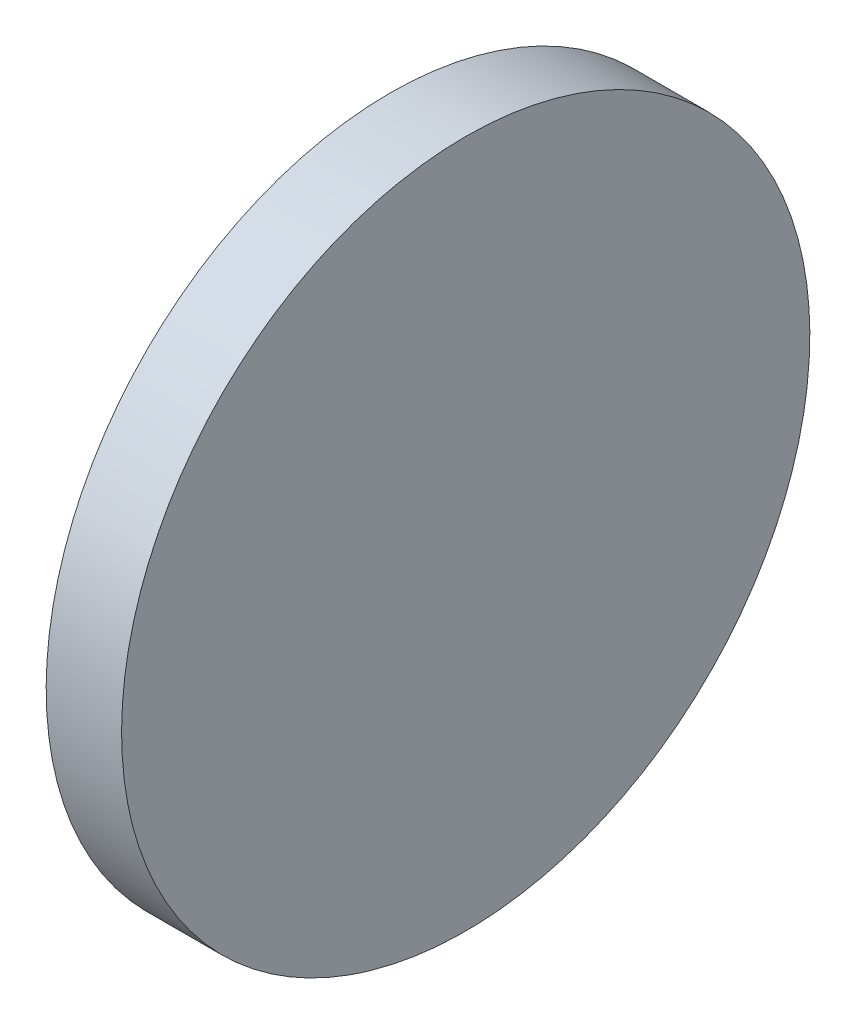
ISO-10303-21;
HEADER;
FILE_DESCRIPTION(('STEP AP214'),'2;1');
FILE_NAME('part.step','',(''),(''),'','','');
FILE_SCHEMA(('AUTOMOTIVE_DESIGN { 1 0 10303 214 1 1 1 1 }'));
ENDSEC;
DATA;
#1=APPLICATION_CONTEXT('core data for automotive mechanical design processes');
#2=APPLICATION_PROTOCOL_DEFINITION('international standard','automotive_design',2000,#1);
#3=PRODUCT_CONTEXT('',#1,'mechanical');
#4=PRODUCT('Part','Part','',(#3));
#5=PRODUCT_RELATED_PRODUCT_CATEGORY('part','',(#4));
#6=PRODUCT_DEFINITION_FORMATION('','',#4);
#7=PRODUCT_DEFINITION_CONTEXT('part definition',#1,'design');
#8=PRODUCT_DEFINITION('design','',#6,#7);
#9=PRODUCT_DEFINITION_SHAPE('','',#8);
#10=(LENGTH_UNIT() NAMED_UNIT(*) SI_UNIT(.MILLI.,.METRE.));
#11=(NAMED_UNIT(*) PLANE_ANGLE_UNIT() SI_UNIT($,.RADIAN.));
#12=(NAMED_UNIT(*) SI_UNIT($,.STERADIAN.) SOLID_ANGLE_UNIT());
#13=UNCERTAINTY_MEASURE_WITH_UNIT(LENGTH_MEASURE(1.E-05),#10,'distance_accuracy_value','');
#14=(GEOMETRIC_REPRESENTATION_CONTEXT(3) GLOBAL_UNCERTAINTY_ASSIGNED_CONTEXT((#13)) GLOBAL_UNIT_ASSIGNED_CONTEXT((#10,
#11,#12)) REPRESENTATION_CONTEXT('',''));
#15=CARTESIAN_POINT('',(0.,0.,0.));
#16=DIRECTION('',(0.,0.,1.));
#17=DIRECTION('',(1.,0.,0.));
#18=AXIS2_PLACEMENT_3D('',#15,#16,#17);
#19=CARTESIAN_POINT('',(445.899457677506,890.681917975775,787.719011934803));
#20=CARTESIAN_POINT('',(445.899457677506,890.681917975775,790.001844551573));
#21=CARTESIAN_POINT('',(445.899457677506,890.232239199665,794.567509785113));
#22=CARTESIAN_POINT('',(445.899457677506,888.234606061943,801.152823703718));
#23=CARTESIAN_POINT('',(445.899457677506,884.990625871862,807.221883769811));
#24=CARTESIAN_POINT('',(445.899457677506,880.624962968881,812.541459408622));
#25=CARTESIAN_POINT('',(445.899457677506,875.30538733007,816.907122311603));
#26=CARTESIAN_POINT('',(445.899457677506,869.236327263976,820.151102501684));
#27=CARTESIAN_POINT('',(445.899457677506,862.651013345372,822.148735639407));
#28=CARTESIAN_POINT('',(445.899457677506,855.802515495061,822.823253803572));
#29=CARTESIAN_POINT('',(445.899457677506,848.954017644751,822.148735639407));
#30=CARTESIAN_POINT('',(445.899457677506,842.368703726147,820.151102501684));
#31=CARTESIAN_POINT('',(445.899457677506,836.299643660053,816.907122311603));
#32=CARTESIAN_POINT('',(445.899457677506,830.980068021242,812.541459408622));
#33=CARTESIAN_POINT('',(445.899457677506,826.614405118261,807.221883769811));
#34=CARTESIAN_POINT('',(445.899457677506,823.37042492818,801.152823703718));
#35=CARTESIAN_POINT('',(445.899457677506,821.372791790458,794.567509785113));
#36=CARTESIAN_POINT('',(445.899457677506,820.698273626292,787.719011934803));
#37=CARTESIAN_POINT('',(445.899457677506,821.372791790458,780.870514084493));
#38=CARTESIAN_POINT('',(445.899457677506,823.37042492818,774.285200165888));
#39=CARTESIAN_POINT('',(445.899457677506,826.614405118261,768.216140099795));
#40=CARTESIAN_POINT('',(445.899457677506,830.980068021242,762.896564460984));
#41=CARTESIAN_POINT('',(445.899457677506,836.299643660053,758.530901558003));
#42=CARTESIAN_POINT('',(445.899457677506,842.368703726147,755.286921367921));
#43=CARTESIAN_POINT('',(445.899457677506,848.954017644751,753.2892882302));
#44=CARTESIAN_POINT('',(445.899457677506,855.802515495061,752.614770066034));
#45=CARTESIAN_POINT('',(445.899457677506,862.651013345372,753.2892882302));
#46=CARTESIAN_POINT('',(445.899457677506,869.236327263976,755.286921367922));
#47=CARTESIAN_POINT('',(445.899457677506,875.30538733007,758.530901558003));
#48=CARTESIAN_POINT('',(445.899457677506,880.62496296888,762.896564460983));
#49=CARTESIAN_POINT('',(445.899457677506,884.990625871862,768.216140099795));
#50=CARTESIAN_POINT('',(445.899457677506,888.234606061943,774.285200165888));
#51=CARTESIAN_POINT('',(445.899457677506,890.232239199665,780.870514084493));
#52=CARTESIAN_POINT('',(445.899457677506,890.681917975775,785.436179318033));
#53=CARTESIAN_POINT('',(445.899457677506,890.681917975775,787.719011934803));
#54=B_SPLINE_CURVE_WITH_KNOTS('',3,(#19,#20,#21,#22,#23,#24,#25,#26,#27,#28,#29,#30,#31,#32,#33,
#34,#35,#36,#37,#38,#39,#40,#41,#42,#43,#44,#45,#46,#47,#48,#49,#50,#51,#52,#53),.UNSPECIFIED.,
.T.,.F.,(4,1,1,1,1,1,1,1,1,1,1,1,1,1,1,1,1,1,1,1,1,1,1,1,1,1,1,1,1,1,1,1,4),(0.,0.03125,
0.0625000000000001,0.0937499999999999,0.125,0.15625,0.1875,0.21875,0.25,0.28125,0.3125,0.34375,
0.375,0.40625,0.4375,0.46875,0.5,0.53125,0.5625,0.59375,0.625,0.65625,0.6875,0.71875,0.75,
0.78125,0.8125,0.84375,0.875,0.90625,0.9375,0.96875,1.),.UNSPECIFIED.);
#55=DIRECTION('',(1.,0.,0.));
#56=VECTOR('',#55,1.);
#57=SURFACE_OF_LINEAR_EXTRUSION('',#54,#56);
#58=CARTESIAN_POINT('',(445.899457677506,890.681917975775,787.719011934803));
#59=CARTESIAN_POINT('',(445.899457677506,890.68191795348,788.175580286464));
#60=CARTESIAN_POINT('',(445.899457677506,890.672924330318,788.632146642336));
#61=CARTESIAN_POINT('',(445.899457677506,890.63701917391,789.544577537184));
#62=CARTESIAN_POINT('',(445.899457677506,890.610107523089,790.000442071537));
#63=CARTESIAN_POINT('',(445.899457677506,890.538435483694,790.910767026361));
#64=CARTESIAN_POINT('',(445.899457677506,890.493675034787,791.36522744208));
#65=CARTESIAN_POINT('',(445.899457677506,890.386374357463,792.272043072159));
#66=CARTESIAN_POINT('',(445.899457677506,890.323834189149,792.72439829363));
#67=CARTESIAN_POINT('',(445.899457677506,890.181042891971,793.626302453057));
#68=CARTESIAN_POINT('',(445.899457677506,890.100791879326,794.07585140941));
#69=CARTESIAN_POINT('',(445.899457677506,889.922648195485,794.971440183581));
#70=CARTESIAN_POINT('',(445.899457677506,889.82475552429,795.417480001401));
#71=CARTESIAN_POINT('',(445.899457677506,889.611533706096,796.305374648089));
#72=CARTESIAN_POINT('',(445.899457677506,889.496204444687,796.747229449477));
#73=CARTESIAN_POINT('',(445.899457677506,889.24831401028,797.626080082421));
#74=CARTESIAN_POINT('',(445.899457677506,889.115752779035,798.063075897548));
#75=CARTESIAN_POINT('',(445.899457677506,888.833602891365,798.931534039254));
#76=CARTESIAN_POINT('',(445.899457677506,888.684014292501,799.362996384533));
#77=CARTESIAN_POINT('',(445.899457677506,888.368013919712,800.219713496664));
#78=CARTESIAN_POINT('',(445.899457677506,888.201602256185,800.64496830423));
#79=CARTESIAN_POINT('',(445.899457677506,887.852160850248,801.488594485701));
#80=CARTESIAN_POINT('',(445.899457677506,887.669131107839,801.906965859606));
#81=CARTESIAN_POINT('',(445.899457677506,887.286786634738,802.73620234562));
#82=CARTESIAN_POINT('',(445.899457677506,887.087471797194,803.147067408455));
#83=CARTESIAN_POINT('',(445.899457677506,886.672889254941,803.960670148471));
#84=CARTESIAN_POINT('',(445.899457677506,886.457621496309,804.363407798173));
#85=CARTESIAN_POINT('',(445.899457677506,886.011465261105,805.160134047703));
#86=CARTESIAN_POINT('',(445.899457677506,885.780576837339,805.5541226771));
#87=CARTESIAN_POINT('',(445.899457677506,885.30351110582,806.332729595679));
#88=CARTESIAN_POINT('',(445.899457677506,885.0573338984,806.71734794633));
#89=CARTESIAN_POINT('',(445.899457677506,884.55002360769,807.476591450865));
#90=CARTESIAN_POINT('',(445.899457677506,884.288890524402,807.85121660475));
#91=CARTESIAN_POINT('',(445.899457677506,883.752116680056,808.589927837828));
#92=CARTESIAN_POINT('',(445.899457677506,883.476475823814,808.95401384785));
#93=CARTESIAN_POINT('',(445.899457677506,882.911133348318,809.671102397682));
#94=CARTESIAN_POINT('',(445.899457677506,882.621431681537,810.024104900022));
#95=CARTESIAN_POINT('',(445.899457677506,882.02841463271,810.718481514477));
#96=CARTESIAN_POINT('',(445.899457677506,881.725099296685,811.059855665894));
#97=CARTESIAN_POINT('',(445.899457677506,881.105301574956,811.730430963671));
#98=CARTESIAN_POINT('',(445.899457677506,880.788819275666,812.059632189894));
#99=CARTESIAN_POINT('',(445.899457677506,880.143135750153,812.705315715407));
#100=CARTESIAN_POINT('',(445.899457677506,879.81393452393,813.021798014698));
#101=CARTESIAN_POINT('',(445.899457677506,879.143359226152,813.641595736426));
#102=CARTESIAN_POINT('',(445.899457677506,878.801985074735,813.944911072451));
#103=CARTESIAN_POINT('',(445.899457677506,878.107608460281,814.537928121278));
#104=CARTESIAN_POINT('',(445.899457677506,877.75460595794,814.827629788059));
#105=CARTESIAN_POINT('',(445.899457677506,877.037517408108,815.392972263555));
#106=CARTESIAN_POINT('',(445.899457677506,876.673431398086,815.668613119798));
#107=CARTESIAN_POINT('',(445.899457677506,875.934720165008,816.205386964143));
#108=CARTESIAN_POINT('',(445.899457677506,875.560095011124,816.466520047432));
#109=CARTESIAN_POINT('',(445.899457677506,874.800851506589,816.973830338141));
#110=CARTESIAN_POINT('',(445.899457677506,874.416233155938,817.220007545562));
#111=CARTESIAN_POINT('',(445.899457677506,873.637626237359,817.697073277081));
#112=CARTESIAN_POINT('',(445.899457677506,873.243637607961,817.927961700847));
#113=CARTESIAN_POINT('',(445.899457677506,872.446911358431,818.37411793605));
#114=CARTESIAN_POINT('',(445.899457677506,872.044173708729,818.589385694683));
#115=CARTESIAN_POINT('',(445.899457677506,871.230570968714,819.003968236935));
#116=CARTESIAN_POINT('',(445.899457677506,870.819705905879,819.203283074479));
#117=CARTESIAN_POINT('',(445.899457677506,869.990469419864,819.58562754758));
#118=CARTESIAN_POINT('',(445.899457677506,869.572098045958,819.76865728999));
#119=CARTESIAN_POINT('',(445.899457677506,868.728471864491,820.118098695926));
#120=CARTESIAN_POINT('',(445.899457677506,868.303217056931,820.284510359453));
#121=CARTESIAN_POINT('',(445.899457677506,867.446499944784,820.600510732243));
#122=CARTESIAN_POINT('',(445.899457677506,867.015037599482,820.750099331108));
#123=CARTESIAN_POINT('',(445.899457677506,866.146579457837,821.032249218776));
#124=CARTESIAN_POINT('',(445.899457677506,865.709583642794,821.16481045002));
#125=CARTESIAN_POINT('',(445.899457677506,864.830733009621,821.412700884431));
#126=CARTESIAN_POINT('',(445.899457677506,864.388878207921,821.528030145846));
#127=CARTESIAN_POINT('',(445.899457677506,863.500983562086,821.741251964023));
#128=CARTESIAN_POINT('',(445.899457677506,863.054943745432,821.839144635196));
#129=CARTESIAN_POINT('',(445.899457677506,862.159354968077,822.017288319098));
#130=CARTESIAN_POINT('',(445.899457677506,861.709806007376,822.097539331828));
#131=CARTESIAN_POINT('',(445.899457677506,860.807901859828,822.240330628775));
#132=CARTESIAN_POINT('',(445.899457677506,860.355546654585,822.302870796776));
#133=CARTESIAN_POINT('',(445.899457677506,859.448730980171,822.410171474957));
#134=CARTESIAN_POINT('',(445.899457677506,858.994270503889,822.454931925036));
#135=CARTESIAN_POINT('',(445.899457677506,858.083945714526,822.52660396123));
#136=CARTESIAN_POINT('',(445.899457677506,857.628081406196,822.553515607678));
#137=CARTESIAN_POINT('',(445.899457677506,856.715649893843,822.589420776034));
#138=CARTESIAN_POINT('',(445.899457677506,856.259082694452,822.598414415517));
#139=CARTESIAN_POINT('',(445.899457677506,855.345948295671,822.598414415517));
#140=CARTESIAN_POINT('',(445.899457677506,854.88938109628,822.589420776034));
#141=CARTESIAN_POINT('',(445.899457677506,853.976949583927,822.553515607677));
#142=CARTESIAN_POINT('',(445.899457677506,853.521085275597,822.52660396123));
#143=CARTESIAN_POINT('',(445.899457677506,852.610760486234,822.454931925036));
#144=CARTESIAN_POINT('',(445.899457677506,852.156300009952,822.410171474957));
#145=CARTESIAN_POINT('',(445.899457677506,851.249484335538,822.302870796776));
#146=CARTESIAN_POINT('',(445.899457677506,850.797129130295,822.240330628775));
#147=CARTESIAN_POINT('',(445.899457677506,849.895224982747,822.097539331828));
#148=CARTESIAN_POINT('',(445.899457677506,849.445676022046,822.017288319098));
#149=CARTESIAN_POINT('',(445.899457677506,848.550087244692,821.839144635196));
#150=CARTESIAN_POINT('',(445.899457677506,848.104047428037,821.741251964023));
#151=CARTESIAN_POINT('',(445.899457677506,847.216152782202,821.528030145846));
#152=CARTESIAN_POINT('',(445.899457677506,846.774297980502,821.41270088443));
#153=CARTESIAN_POINT('',(445.899457677506,845.895447347329,821.16481045002));
#154=CARTESIAN_POINT('',(445.899457677506,845.458451532286,821.032249218776));
#155=CARTESIAN_POINT('',(445.899457677506,844.589993390641,820.750099331108));
#156=CARTESIAN_POINT('',(445.899457677506,844.158531045339,820.600510732243));
#157=CARTESIAN_POINT('',(445.899457677506,843.301813933192,820.284510359453));
#158=CARTESIAN_POINT('',(445.899457677506,842.876559125632,820.118098695926));
#159=CARTESIAN_POINT('',(445.899457677506,842.032932944165,819.76865728999));
#160=CARTESIAN_POINT('',(445.899457677506,841.614561570259,819.58562754758));
#161=CARTESIAN_POINT('',(445.899457677506,840.785325084244,819.203283074479));
#162=CARTESIAN_POINT('',(445.899457677506,840.374460021409,819.003968236935));
#163=CARTESIAN_POINT('',(445.899457677506,839.560857281394,818.589385694683));
#164=CARTESIAN_POINT('',(445.899457677506,839.158119631692,818.37411793605));
#165=CARTESIAN_POINT('',(445.899457677506,838.361393382162,817.927961700847));
#166=CARTESIAN_POINT('',(445.899457677506,837.967404752764,817.697073277081));
#167=CARTESIAN_POINT('',(445.899457677506,837.188797834185,817.220007545562));
#168=CARTESIAN_POINT('',(445.899457677506,836.804179483534,816.973830338141));
#169=CARTESIAN_POINT('',(445.899457677506,836.044935978999,816.466520047432));
#170=CARTESIAN_POINT('',(445.899457677506,835.670310825115,816.205386964143));
#171=CARTESIAN_POINT('',(445.899457677506,834.931599592037,815.668613119798));
#172=CARTESIAN_POINT('',(445.899457677506,834.567513582015,815.392972263555));
#173=CARTESIAN_POINT('',(445.899457677506,833.850425032183,814.827629788059));
#174=CARTESIAN_POINT('',(445.899457677506,833.497422529842,814.537928121278));
#175=CARTESIAN_POINT('',(445.899457677506,832.803045915388,813.944911072451));
#176=CARTESIAN_POINT('',(445.899457677506,832.46167176397,813.641595736426));
#177=CARTESIAN_POINT('',(445.899457677506,831.791096466193,813.021798014698));
#178=CARTESIAN_POINT('',(445.899457677506,831.461895239971,812.705315715407));
#179=CARTESIAN_POINT('',(445.899457677506,830.816211714457,812.059632189894));
#180=CARTESIAN_POINT('',(445.899457677506,830.499729415166,811.730430963671));
#181=CARTESIAN_POINT('',(445.899457677506,829.879931693438,811.059855665894));
#182=CARTESIAN_POINT('',(445.899457677506,829.576616357413,810.718481514477));
#183=CARTESIAN_POINT('',(445.899457677506,828.983599308586,810.024104900022));
#184=CARTESIAN_POINT('',(445.899457677506,828.693897641806,809.671102397682));
#185=CARTESIAN_POINT('',(445.899457677506,828.128555166309,808.95401384785));
#186=CARTESIAN_POINT('',(445.899457677506,827.852914310067,808.589927837828));
#187=CARTESIAN_POINT('',(445.899457677506,827.316140465721,807.85121660475));
#188=CARTESIAN_POINT('',(445.899457677506,827.055007382433,807.476591450865));
#189=CARTESIAN_POINT('',(445.899457677506,826.547697091723,806.71734794633));
#190=CARTESIAN_POINT('',(445.899457677506,826.301519884303,806.332729595679));
#191=CARTESIAN_POINT('',(445.899457677506,825.824454152783,805.5541226771));
#192=CARTESIAN_POINT('',(445.899457677506,825.593565729018,805.160134047703));
#193=CARTESIAN_POINT('',(445.899457677506,825.147409493814,804.363407798173));
#194=CARTESIAN_POINT('',(445.899457677506,824.932141735182,803.960670148471));
#195=CARTESIAN_POINT('',(445.899457677506,824.517559192929,803.147067408456));
#196=CARTESIAN_POINT('',(445.899457677506,824.318244355385,802.73620234562));
#197=CARTESIAN_POINT('',(445.899457677506,823.935899882284,801.906965859606));
#198=CARTESIAN_POINT('',(445.899457677506,823.752870139875,801.488594485699));
#199=CARTESIAN_POINT('',(445.899457677506,823.403428733938,800.644968304233));
#200=CARTESIAN_POINT('',(445.899457677506,823.237017070411,800.219713496673));
#201=CARTESIAN_POINT('',(445.899457677506,822.921016697622,799.362996384526));
#202=CARTESIAN_POINT('',(445.899457677506,822.771428098757,798.931534039224));
#203=CARTESIAN_POINT('',(445.899457677506,822.489278211089,798.063075897579));
#204=CARTESIAN_POINT('',(445.899457677506,822.356716979845,797.626080082535));
#205=CARTESIAN_POINT('',(445.899457677506,822.108826545434,796.747229449362));
#206=CARTESIAN_POINT('',(445.899457677506,821.993497284019,796.305374647663));
#207=CARTESIAN_POINT('',(445.899457677506,821.780275465842,795.417480001828));
#208=CARTESIAN_POINT('',(445.899457677506,821.682382794668,794.971440185173));
#209=CARTESIAN_POINT('',(445.899457677506,821.504239110766,794.075851407818));
#210=CARTESIAN_POINT('',(445.899457677506,821.423988098037,793.626302447118));
#211=CARTESIAN_POINT('',(445.899457677506,821.281196801089,792.72439829957));
#212=CARTESIAN_POINT('',(445.899457677506,821.218656633089,792.272043094327));
#213=CARTESIAN_POINT('',(445.899457677506,821.111355954907,791.365227419913));
#214=CARTESIAN_POINT('',(445.899457677506,821.066595504828,790.910766943631));
#215=CARTESIAN_POINT('',(445.899457677506,820.994923468635,790.000442154267));
#216=CARTESIAN_POINT('',(445.899457677506,820.968011822187,789.544577845938));
#217=CARTESIAN_POINT('',(445.899457677506,820.93210665383,788.632146333585));
#218=CARTESIAN_POINT('',(445.899457677506,820.923113014347,788.175579134194));
#219=CARTESIAN_POINT('',(445.899457677506,820.923113014347,787.262444735412));
#220=CARTESIAN_POINT('',(445.899457677506,820.93210665383,786.805877536021));
#221=CARTESIAN_POINT('',(445.899457677506,820.968011822187,785.893446023669));
#222=CARTESIAN_POINT('',(445.899457677506,820.994923468635,785.437581715339));
#223=CARTESIAN_POINT('',(445.899457677506,821.066595504828,784.527256925976));
#224=CARTESIAN_POINT('',(445.899457677506,821.111355954907,784.072796449693));
#225=CARTESIAN_POINT('',(445.899457677506,821.218656633089,783.165980775279));
#226=CARTESIAN_POINT('',(445.899457677506,821.281196801089,782.713625570037));
#227=CARTESIAN_POINT('',(445.899457677506,821.423988098037,781.811721422488));
#228=CARTESIAN_POINT('',(445.899457677506,821.504239110766,781.362172461788));
#229=CARTESIAN_POINT('',(445.899457677506,821.682382794669,780.466583684433));
#230=CARTESIAN_POINT('',(445.899457677506,821.780275465842,780.020543867778));
#231=CARTESIAN_POINT('',(445.899457677506,821.993497284019,779.132649221943));
#232=CARTESIAN_POINT('',(445.899457677506,822.108826545434,778.690794420244));
#233=CARTESIAN_POINT('',(445.899457677506,822.356716979845,777.811943787071));
#234=CARTESIAN_POINT('',(445.899457677506,822.489278211089,777.374947972027));
#235=CARTESIAN_POINT('',(445.899457677506,822.771428098757,776.506489830382));
#236=CARTESIAN_POINT('',(445.899457677506,822.921016697622,776.075027485081));
#237=CARTESIAN_POINT('',(445.899457677506,823.237017070411,775.218310372933));
#238=CARTESIAN_POINT('',(445.899457677506,823.403428733938,774.793055565373));
#239=CARTESIAN_POINT('',(445.899457677506,823.752870139875,773.949429383907));
#240=CARTESIAN_POINT('',(445.899457677506,823.935899882284,773.53105801));
#241=CARTESIAN_POINT('',(445.899457677506,824.318244355385,772.701821523986));
#242=CARTESIAN_POINT('',(445.899457677506,824.517559192929,772.290956461151));
#243=CARTESIAN_POINT('',(445.899457677506,824.932141735182,771.477353721136));
#244=CARTESIAN_POINT('',(445.899457677506,825.147409493814,771.074616071433));
#245=CARTESIAN_POINT('',(445.899457677506,825.593565729017,770.277889821903));
#246=CARTESIAN_POINT('',(445.899457677506,825.824454152783,769.883901192506));
#247=CARTESIAN_POINT('',(445.899457677506,826.301519884303,769.105294273927));
#248=CARTESIAN_POINT('',(445.899457677506,826.547697091723,768.720675923276));
#249=CARTESIAN_POINT('',(445.899457677506,827.055007382433,767.961432418741));
#250=CARTESIAN_POINT('',(445.899457677506,827.316140465721,767.586807264856));
#251=CARTESIAN_POINT('',(445.899457677506,827.852914310067,766.848096031778));
#252=CARTESIAN_POINT('',(445.899457677506,828.128555166309,766.484010021756));
#253=CARTESIAN_POINT('',(445.899457677506,828.693897641806,765.766921471924));
#254=CARTESIAN_POINT('',(445.899457677506,828.983599308586,765.413918969584));
#255=CARTESIAN_POINT('',(445.899457677506,829.576616357413,764.719542355129));
#256=CARTESIAN_POINT('',(445.899457677506,829.879931693438,764.378168203712));
#257=CARTESIAN_POINT('',(445.899457677506,830.499729415166,763.707592905935));
#258=CARTESIAN_POINT('',(445.899457677506,830.816211714457,763.378391679712));
#259=CARTESIAN_POINT('',(445.899457677506,831.461895239971,762.732708154199));
#260=CARTESIAN_POINT('',(445.899457677506,831.791096466193,762.416225854908));
#261=CARTESIAN_POINT('',(445.899457677506,832.46167176397,761.796428133179));
#262=CARTESIAN_POINT('',(445.899457677506,832.803045915387,761.493112797155));
#263=CARTESIAN_POINT('',(445.899457677506,833.497422529842,760.900095748328));
#264=CARTESIAN_POINT('',(445.899457677506,833.850425032183,760.610394081547));
#265=CARTESIAN_POINT('',(445.899457677506,834.567513582015,760.045051606051));
#266=CARTESIAN_POINT('',(445.899457677506,834.931599592037,759.769410749808));
#267=CARTESIAN_POINT('',(445.899457677506,835.670310825115,759.232636905463));
#268=CARTESIAN_POINT('',(445.899457677506,836.044935978999,758.971503822174));
#269=CARTESIAN_POINT('',(445.899457677506,836.804179483534,758.464193531465));
#270=CARTESIAN_POINT('',(445.899457677506,837.188797834185,758.218016324044));
#271=CARTESIAN_POINT('',(445.899457677506,837.967404752764,757.740950592525));
#272=CARTESIAN_POINT('',(445.899457677506,838.361393382162,757.510062168759));
#273=CARTESIAN_POINT('',(445.899457677506,839.158119631692,757.063905933556));
#274=CARTESIAN_POINT('',(445.899457677506,839.560857281394,756.848638174923));
#275=CARTESIAN_POINT('',(445.899457677506,840.374460021409,756.43405563267));
#276=CARTESIAN_POINT('',(445.899457677506,840.785325084244,756.234740795127));
#277=CARTESIAN_POINT('',(445.899457677506,841.614561570259,755.852396322025));
#278=CARTESIAN_POINT('',(445.899457677506,842.032932944165,755.669366579616));
#279=CARTESIAN_POINT('',(445.899457677506,842.876559125632,755.31992517368));
#280=CARTESIAN_POINT('',(445.899457677506,843.301813933192,755.153513510153));
#281=CARTESIAN_POINT('',(445.899457677506,844.158531045339,754.837513137363));
#282=CARTESIAN_POINT('',(445.899457677506,844.589993390641,754.687924538498));
#283=CARTESIAN_POINT('',(445.899457677506,845.458451532286,754.40577465083));
#284=CARTESIAN_POINT('',(445.899457677506,845.895447347329,754.273213419587));
#285=CARTESIAN_POINT('',(445.899457677506,846.774297980502,754.025322985176));
#286=CARTESIAN_POINT('',(445.899457677506,847.216152782202,753.90999372376));
#287=CARTESIAN_POINT('',(445.899457677506,848.104047428037,753.696771905583));
#288=CARTESIAN_POINT('',(445.899457677506,848.550087244691,753.59887923441));
#289=CARTESIAN_POINT('',(445.899457677506,849.445676022046,753.420735550508));
#290=CARTESIAN_POINT('',(445.899457677506,849.895224982747,753.340484537779));
#291=CARTESIAN_POINT('',(445.899457677506,850.797129130295,753.197693240831));
#292=CARTESIAN_POINT('',(445.899457677506,851.249484335538,753.13515307283));
#293=CARTESIAN_POINT('',(445.899457677506,852.156300009952,753.027852394649));
#294=CARTESIAN_POINT('',(445.899457677506,852.610760486234,752.98309194457));
#295=CARTESIAN_POINT('',(445.899457677506,853.521085275597,752.911419908376));
#296=CARTESIAN_POINT('',(445.899457677506,853.976949583927,752.884508261929));
#297=CARTESIAN_POINT('',(445.899457677506,854.88938109628,752.848603093572));
#298=CARTESIAN_POINT('',(445.899457677506,855.345948295671,752.839609454089));
#299=CARTESIAN_POINT('',(445.899457677506,856.259082694452,752.839609454089));
#300=CARTESIAN_POINT('',(445.899457677506,856.715649893843,752.848603093572));
#301=CARTESIAN_POINT('',(445.899457677506,857.628081406196,752.884508261929));
#302=CARTESIAN_POINT('',(445.899457677506,858.083945714526,752.911419908376));
#303=CARTESIAN_POINT('',(445.899457677506,858.994270503889,752.98309194457));
#304=CARTESIAN_POINT('',(445.899457677506,859.448730980171,753.027852394649));
#305=CARTESIAN_POINT('',(445.899457677506,860.355546654585,753.13515307283));
#306=CARTESIAN_POINT('',(445.899457677506,860.807901859828,753.197693240831));
#307=CARTESIAN_POINT('',(445.899457677506,861.709806007376,753.340484537779));
#308=CARTESIAN_POINT('',(445.899457677506,862.159354968077,753.420735550508));
#309=CARTESIAN_POINT('',(445.899457677506,863.054943745432,753.59887923441));
#310=CARTESIAN_POINT('',(445.899457677506,863.500983562086,753.696771905583));
#311=CARTESIAN_POINT('',(445.899457677506,864.388878207921,753.909993723761));
#312=CARTESIAN_POINT('',(445.899457677506,864.830733009621,754.025322985176));
#313=CARTESIAN_POINT('',(445.899457677506,865.709583642794,754.273213419587));
#314=CARTESIAN_POINT('',(445.899457677506,866.146579457837,754.40577465083));
#315=CARTESIAN_POINT('',(445.899457677506,867.015037599482,754.687924538498));
#316=CARTESIAN_POINT('',(445.899457677506,867.446499944784,754.837513137363));
#317=CARTESIAN_POINT('',(445.899457677506,868.303217056931,755.153513510153));
#318=CARTESIAN_POINT('',(445.899457677506,868.728471864491,755.31992517368));
#319=CARTESIAN_POINT('',(445.899457677506,869.572098045958,755.669366579616));
#320=CARTESIAN_POINT('',(445.899457677506,869.990469419864,755.852396322026));
#321=CARTESIAN_POINT('',(445.899457677506,870.819705905879,756.234740795127));
#322=CARTESIAN_POINT('',(445.899457677506,871.230570968714,756.43405563267));
#323=CARTESIAN_POINT('',(445.899457677506,872.044173708729,756.848638174923));
#324=CARTESIAN_POINT('',(445.899457677506,872.446911358431,757.063905933556));
#325=CARTESIAN_POINT('',(445.899457677506,873.243637607961,757.510062168759));
#326=CARTESIAN_POINT('',(445.899457677506,873.637626237359,757.740950592525));
#327=CARTESIAN_POINT('',(445.899457677506,874.416233155938,758.218016324044));
#328=CARTESIAN_POINT('',(445.899457677506,874.800851506589,758.464193531465));
#329=CARTESIAN_POINT('',(445.899457677506,875.560095011124,758.971503822174));
#330=CARTESIAN_POINT('',(445.899457677506,875.934720165008,759.232636905463));
#331=CARTESIAN_POINT('',(445.899457677506,876.673431398086,759.769410749808));
#332=CARTESIAN_POINT('',(445.899457677506,877.037517408108,760.045051606051));
#333=CARTESIAN_POINT('',(445.899457677506,877.75460595794,760.610394081547));
#334=CARTESIAN_POINT('',(445.899457677506,878.107608460281,760.900095748328));
#335=CARTESIAN_POINT('',(445.899457677506,878.801985074735,761.493112797154));
#336=CARTESIAN_POINT('',(445.899457677506,879.143359226153,761.796428133179));
#337=CARTESIAN_POINT('',(445.899457677506,879.81393452393,762.416225854908));
#338=CARTESIAN_POINT('',(445.899457677506,880.143135750152,762.732708154199));
#339=CARTESIAN_POINT('',(445.899457677506,880.788819275666,763.378391679712));
#340=CARTESIAN_POINT('',(445.899457677506,881.105301574956,763.707592905934));
#341=CARTESIAN_POINT('',(445.899457677506,881.725099296685,764.378168203712));
#342=CARTESIAN_POINT('',(445.899457677506,882.02841463271,764.719542355129));
#343=CARTESIAN_POINT('',(445.899457677506,882.621431681537,765.413918969584));
#344=CARTESIAN_POINT('',(445.899457677506,882.911133348317,765.766921471924));
#345=CARTESIAN_POINT('',(445.899457677506,883.476475823814,766.484010021756));
#346=CARTESIAN_POINT('',(445.899457677506,883.752116680056,766.848096031778));
#347=CARTESIAN_POINT('',(445.899457677506,884.288890524402,767.586807264856));
#348=CARTESIAN_POINT('',(445.899457677506,884.55002360769,767.961432418741));
#349=CARTESIAN_POINT('',(445.899457677506,885.0573338984,768.720675923276));
#350=CARTESIAN_POINT('',(445.899457677506,885.30351110582,769.105294273927));
#351=CARTESIAN_POINT('',(445.899457677506,885.78057683734,769.883901192506));
#352=CARTESIAN_POINT('',(445.899457677506,886.011465261106,770.277889821903));
#353=CARTESIAN_POINT('',(445.899457677506,886.457621496309,771.074616071433));
#354=CARTESIAN_POINT('',(445.899457677506,886.672889254941,771.477353721135));
#355=CARTESIAN_POINT('',(445.899457677506,887.087471797194,772.290956461151));
#356=CARTESIAN_POINT('',(445.899457677506,887.286786634738,772.701821523986));
#357=CARTESIAN_POINT('',(445.899457677506,887.669131107839,773.53105801));
#358=CARTESIAN_POINT('',(445.899457677506,887.852160850248,773.949429383905));
#359=CARTESIAN_POINT('',(445.899457677506,888.201602256185,774.793055565375));
#360=CARTESIAN_POINT('',(445.899457677506,888.368013919712,775.218310372941));
#361=CARTESIAN_POINT('',(445.899457677506,888.684014292501,776.075027485072));
#362=CARTESIAN_POINT('',(445.899457677506,888.833602891366,776.506489830351));
#363=CARTESIAN_POINT('',(445.899457677506,889.115752779035,777.374947972058));
#364=CARTESIAN_POINT('',(445.899457677506,889.24831401028,777.811943787185));
#365=CARTESIAN_POINT('',(445.899457677506,889.496204444687,778.690794420129));
#366=CARTESIAN_POINT('',(445.899457677506,889.611533706096,779.132649221517));
#367=CARTESIAN_POINT('',(445.899457677506,889.82475552429,780.020543868205));
#368=CARTESIAN_POINT('',(445.899457677506,889.922648195485,780.466583686024));
#369=CARTESIAN_POINT('',(445.899457677506,890.100791879326,781.362172460196));
#370=CARTESIAN_POINT('',(445.899457677506,890.181042891971,781.811721416548));
#371=CARTESIAN_POINT('',(445.899457677506,890.323834189149,782.713625575976));
#372=CARTESIAN_POINT('',(445.899457677506,890.386374357463,783.165980797447));
#373=CARTESIAN_POINT('',(445.899457677506,890.493675034787,784.072796427526));
#374=CARTESIAN_POINT('',(445.899457677506,890.538435483694,784.527256843245));
#375=CARTESIAN_POINT('',(445.899457677506,890.610107523089,785.437581798069));
#376=CARTESIAN_POINT('',(445.899457677506,890.63701917391,785.893446332421));
#377=CARTESIAN_POINT('',(445.899457677506,890.672924330319,786.80587722727));
#378=CARTESIAN_POINT('',(445.899457677506,890.68191795348,787.262443583141));
#379=CARTESIAN_POINT('',(445.899457677506,890.681917975775,787.719011934803));
#380=B_SPLINE_CURVE_WITH_KNOTS('',3,(#58,#59,#60,#61,#62,#63,#64,#65,#66,#67,#68,#69,#70,#71,
#72,#73,#74,#75,#76,#77,#78,#79,#80,#81,#82,#83,#84,#85,#86,#87,#88,#89,#90,#91,#92,#93,#94,#95,
#96,#97,#98,#99,#100,#101,#102,#103,#104,#105,#106,#107,#108,#109,#110,#111,#112,#113,#114,#115,
#116,#117,#118,#119,#120,#121,#122,#123,#124,#125,#126,#127,#128,#129,#130,#131,#132,#133,#134,
#135,#136,#137,#138,#139,#140,#141,#142,#143,#144,#145,#146,#147,#148,#149,#150,#151,#152,#153,
#154,#155,#156,#157,#158,#159,#160,#161,#162,#163,#164,#165,#166,#167,#168,#169,#170,#171,#172,
#173,#174,#175,#176,#177,#178,#179,#180,#181,#182,#183,#184,#185,#186,#187,#188,#189,#190,#191,
#192,#193,#194,#195,#196,#197,#198,#199,#200,#201,#202,#203,#204,#205,#206,#207,#208,#209,#210,
#211,#212,#213,#214,#215,#216,#217,#218,#219,#220,#221,#222,#223,#224,#225,#226,#227,#228,#229,
#230,#231,#232,#233,#234,#235,#236,#237,#238,#239,#240,#241,#242,#243,#244,#245,#246,#247,#248,
#249,#250,#251,#252,#253,#254,#255,#256,#257,#258,#259,#260,#261,#262,#263,#264,#265,#266,#267,
#268,#269,#270,#271,#272,#273,#274,#275,#276,#277,#278,#279,#280,#281,#282,#283,#284,#285,#286,
#287,#288,#289,#290,#291,#292,#293,#294,#295,#296,#297,#298,#299,#300,#301,#302,#303,#304,#305,
#306,#307,#308,#309,#310,#311,#312,#313,#314,#315,#316,#317,#318,#319,#320,#321,#322,#323,#324,
#325,#326,#327,#328,#329,#330,#331,#332,#333,#334,#335,#336,#337,#338,#339,#340,#341,#342,#343,
#344,#345,#346,#347,#348,#349,#350,#351,#352,#353,#354,#355,#356,#357,#358,#359,#360,#361,#362,
#363,#364,#365,#366,#367,#368,#369,#370,#371,#372,#373,#374,#375,#376,#377,#378,#379),
.UNSPECIFIED.,.F.,.F.,(4,2,2,2,2,2,2,2,2,2,2,2,2,2,2,2,2,2,2,2,2,2,2,2,2,2,2,2,2,2,2,2,2,2,2,2,
2,2,2,2,2,2,2,2,2,2,2,2,2,2,2,2,2,2,2,2,2,2,2,2,2,2,2,2,2,2,2,2,2,2,2,2,2,2,2,2,2,2,2,2,2,2,2,2,
2,2,2,2,2,2,2,2,2,2,2,2,2,2,2,2,2,2,2,2,2,2,2,2,2,2,2,2,2,2,2,2,2,2,2,2,2,2,2,2,2,2,2,2,2,2,2,2,
2,2,2,2,2,2,2,2,2,2,2,2,2,2,2,2,2,2,2,2,2,2,2,2,2,2,2,2,4),(0.,1.3696137570063,2.73923650121394,
4.10886387516885,5.47848661937657,6.84810037638282,8.2177141333893,9.58733687759665,
10.9569642515518,12.3265869957594,13.6962007527658,15.0658145097722,16.4354372539798,
17.8050646279348,19.1746873721424,20.5443011291488,21.9139148861551,23.2835376303627,
24.6531650043175,26.0227877485253,27.3924015055315,28.762015262538,30.1316380067456,
31.5012653807006,32.8708881249082,34.2405018819145,35.610115638921,36.9797383831285,
38.3493657570836,39.7189885012912,41.0886022582975,42.458216015304,43.8278387595115,
45.1974661334664,46.5670888776742,47.9367026346805,49.3063163916868,50.6759391358944,
52.0455665098493,53.4151892540571,54.7848030110635,56.1544167680698,57.5240395122772,
58.8936668862323,60.2632896304399,61.6329033874463,63.0025171444527,64.3721398886604,
65.7417672626152,67.111390006823,68.4810037638294,69.8506175208358,71.2202402650433,
72.5898676389983,73.9594903832059,75.3291041402123,76.6987178972186,78.0683406414263,
79.4379680153813,80.8075907595889,82.1772045165953,83.5468182736016,84.9164410178092,
86.2860683917641,87.6556911359718,89.0253048929781,90.3949186499844,91.7645413941919,
93.1341687681469,94.5037915123547,95.8734052693609,97.2430190263673,98.6126417705749,
99.9822691445301,101.351891888738,102.721505645744,104.09111940275,105.460742146958,
106.830369520913,108.199992265121,109.569606022127,110.939219779133,112.308842523341,
113.678469897296,115.048092641503,116.41770639851,117.787320155516,119.156942899724,
120.526570273679,121.896193017887,123.265806774893,124.635420531899,126.005043276107,
127.374670650062,128.744293394269,130.113907151276,131.483520908282,132.85314365249,
134.222771026445,135.592393770652,136.962007527659,138.331621284665,139.701244028873,
141.070871402828,142.440494147035,143.810107904042,145.179721661048,146.549344405256,
147.918971779211,149.288594523418,150.658208280425,152.027822037431,153.397444781638,
154.767072155594,156.136694899801,157.506308656808,158.875922413814,160.245545158021,
161.615172531977,162.984795276184,164.354409033191,165.724022790197,167.093645534404,
168.46327290836,169.832895652567,171.202509409574,172.57212316658,173.941745910788,
175.311373284742,176.68099602895,178.050609785956,179.420223542963,180.78984628717,
182.159473661125,183.529096405333,184.898710162339,186.268323919346,187.637946663553,
189.007574037508,190.377196781716,191.746810538722,193.116424295728,194.486047039936,
195.855674413891,197.225297158099,198.594910915105,199.964524672112,201.334147416319,
202.703774790274,204.073397534482,205.443011291488,206.812625048494,208.182247792702,
209.551875166657,210.921497910865,212.291111667871,213.660725424877,215.030348169085,
216.39997554304,217.769598287248,219.139212044254),.UNSPECIFIED.);
#381=CARTESIAN_POINT('',(445.899457677506,890.681917975775,787.719011934803));
#382=VERTEX_POINT('',#381);
#383=EDGE_CURVE('E9',#382,#382,#380,.T.);
#384=ORIENTED_EDGE('',*,*,#383,.T.);
#385=EDGE_LOOP('',(#384));
#386=FACE_BOUND('',#385,.T.);
#387=CARTESIAN_POINT('',(453.543651110175,890.681917975775,787.719011934803));
#388=CARTESIAN_POINT('',(453.543651110175,890.681917609369,787.165594808027));
#389=CARTESIAN_POINT('',(453.543651110175,890.668703990687,786.612181367693));
#390=CARTESIAN_POINT('',(453.543651110175,890.615972652834,785.506604346749));
#391=CARTESIAN_POINT('',(453.543651110175,890.576454732714,784.95444077572));
#392=CARTESIAN_POINT('',(453.543651110175,890.471237166634,783.852614126665));
#393=CARTESIAN_POINT('',(453.543651110175,890.405537504167,783.302951050217));
#394=CARTESIAN_POINT('',(453.543651110175,890.248082899417,782.207372023727));
#395=CARTESIAN_POINT('',(453.543651110175,890.156328148495,781.661456046195));
#396=CARTESIAN_POINT('',(453.543651110175,889.946871166425,780.574625474276));
#397=CARTESIAN_POINT('',(453.543651110175,889.829168979943,780.033710871282));
#398=CARTESIAN_POINT('',(453.543651110175,889.568160257801,778.958091920036));
#399=CARTESIAN_POINT('',(453.543651110175,889.424853525622,778.423387619485));
#400=CARTESIAN_POINT('',(453.543651110175,889.113004369332,777.361388598074));
#401=CARTESIAN_POINT('',(453.543651110175,888.94446189787,776.834093891119));
#402=CARTESIAN_POINT('',(453.543651110175,888.582509293103,775.788112292549));
#403=CARTESIAN_POINT('',(453.543651110175,888.389099329472,775.269425342229));
#404=CARTESIAN_POINT('',(453.543651110175,887.977754351798,774.24187055006));
#405=CARTESIAN_POINT('',(453.543651110175,887.759819419665,773.733002675424));
#406=CARTESIAN_POINT('',(453.543651110175,887.299969586887,772.726216792648));
#407=CARTESIAN_POINT('',(453.543651110175,887.058054508416,772.228298865742));
#408=CARTESIAN_POINT('',(453.543651110175,886.550846443228,771.244514658238));
#409=CARTESIAN_POINT('',(453.543651110175,886.285553384582,770.758648414726));
#410=CARTESIAN_POINT('',(453.543651110175,885.732183029948,769.800071412737));
#411=CARTESIAN_POINT('',(453.543651110175,885.444105873072,769.327360573962));
#412=CARTESIAN_POINT('',(453.543651110175,884.845737470466,768.396216184388));
#413=CARTESIAN_POINT('',(453.543651110175,884.535446330734,767.937782565479));
#414=CARTESIAN_POINT('',(453.543651110175,883.893376979541,767.036214644667));
#415=CARTESIAN_POINT('',(453.543651110175,883.56159862109,766.593080447457));
#416=CARTESIAN_POINT('',(453.543651110175,882.877366145647,765.723070885126));
#417=CARTESIAN_POINT('',(453.543651110175,882.524911941779,765.296195588333));
#418=CARTESIAN_POINT('',(453.543651110175,881.800123653879,764.459671988128));
#419=CARTESIAN_POINT('',(453.543651110175,881.427789673657,764.050023594777));
#420=CARTESIAN_POINT('',(453.543651110175,880.664021093159,763.248940823269));
#421=CARTESIAN_POINT('',(453.543651110175,880.272586606595,762.857506336705));
#422=CARTESIAN_POINT('',(453.543651110175,879.471503835088,762.093737756207));
#423=CARTESIAN_POINT('',(453.543651110175,879.061855441736,761.721403775986));
#424=CARTESIAN_POINT('',(453.543651110175,878.225331841531,760.996615488085));
#425=CARTESIAN_POINT('',(453.543651110175,877.798456544739,760.644161284217));
#426=CARTESIAN_POINT('',(453.543651110175,876.928446982408,759.959928808774));
#427=CARTESIAN_POINT('',(453.543651110175,876.485312785198,759.628150450323));
#428=CARTESIAN_POINT('',(453.543651110175,875.583744864385,758.986081099131));
#429=CARTESIAN_POINT('',(453.543651110175,875.125311245476,758.675789959398));
#430=CARTESIAN_POINT('',(453.543651110175,874.194166855903,758.077421556793));
#431=CARTESIAN_POINT('',(453.543651110175,873.721456017129,757.789344399917));
#432=CARTESIAN_POINT('',(453.543651110175,872.762879015138,757.235974045283));
#433=CARTESIAN_POINT('',(453.543651110175,872.277012771623,756.970680986636));
#434=CARTESIAN_POINT('',(453.543651110175,871.293228564126,756.463472921449));
#435=CARTESIAN_POINT('',(453.543651110175,870.795310637232,756.22155784298));
#436=CARTESIAN_POINT('',(453.543651110175,869.788524754426,755.761708010197));
#437=CARTESIAN_POINT('',(453.543651110175,869.279656879748,755.543773078057));
#438=CARTESIAN_POINT('',(453.543651110175,868.252102087692,755.132428100403));
#439=CARTESIAN_POINT('',(453.543651110175,867.733415137526,754.939018136798));
#440=CARTESIAN_POINT('',(453.543651110175,866.687433538534,754.577065531958));
#441=CARTESIAN_POINT('',(453.543651110175,866.160138831003,754.408523060397));
#442=CARTESIAN_POINT('',(453.543651110175,865.098139811168,754.096673904378));
#443=CARTESIAN_POINT('',(453.543651110175,864.563435512768,753.95336717257));
#444=CARTESIAN_POINT('',(453.543651110175,863.487816555643,753.692358449416));
#445=CARTESIAN_POINT('',(453.543651110175,862.946901944617,753.57465626155));
#446=CARTESIAN_POINT('',(453.543651110175,861.860071394641,753.365199283258));
#447=CARTESIAN_POINT('',(453.543651110175,861.314155447083,753.273444537497));
#448=CARTESIAN_POINT('',(453.543651110175,860.218576338702,753.115989918649));
#449=CARTESIAN_POINT('',(453.543651110175,859.668913150387,753.050290236923));
#450=CARTESIAN_POINT('',(453.543651110175,858.567086806956,752.945072723457));
#451=CARTESIAN_POINT('',(453.543651110175,858.014923653417,752.90555487521));
#452=CARTESIAN_POINT('',(453.543651110175,856.909345491875,752.852823340999));
#453=CARTESIAN_POINT('',(453.543651110175,856.355930493468,752.839609454089));
#454=CARTESIAN_POINT('',(453.543651110175,855.249100496655,752.839609454089));
#455=CARTESIAN_POINT('',(453.543651110175,854.695685498248,752.852823340999));
#456=CARTESIAN_POINT('',(453.543651110175,853.590107336706,752.90555487521));
#457=CARTESIAN_POINT('',(453.543651110175,853.037944183167,752.945072723457));
#458=CARTESIAN_POINT('',(453.543651110175,851.936117839736,753.050290236923));
#459=CARTESIAN_POINT('',(453.543651110175,851.386454651421,753.115989918648));
#460=CARTESIAN_POINT('',(453.543651110175,850.29087554304,753.273444537497));
#461=CARTESIAN_POINT('',(453.543651110175,849.744959595482,753.365199283258));
#462=CARTESIAN_POINT('',(453.543651110175,848.658129045506,753.57465626155));
#463=CARTESIAN_POINT('',(453.543651110175,848.11721443448,753.692358449415));
#464=CARTESIAN_POINT('',(453.543651110175,847.041595477355,753.953367172569));
#465=CARTESIAN_POINT('',(453.543651110175,846.506891178955,754.096673904378));
#466=CARTESIAN_POINT('',(453.543651110175,845.44489215912,754.408523060397));
#467=CARTESIAN_POINT('',(453.543651110175,844.917597451589,754.577065531958));
#468=CARTESIAN_POINT('',(453.543651110175,843.871615852597,754.939018136798));
#469=CARTESIAN_POINT('',(453.543651110175,843.352928902431,755.132428100403));
#470=CARTESIAN_POINT('',(453.543651110175,842.325374110375,755.543773078057));
#471=CARTESIAN_POINT('',(453.543651110175,841.816506235697,755.761708010197));
#472=CARTESIAN_POINT('',(453.543651110175,840.809720352891,756.22155784298));
#473=CARTESIAN_POINT('',(453.543651110175,840.311802425996,756.463472921449));
#474=CARTESIAN_POINT('',(453.543651110175,839.3280182185,756.970680986636));
#475=CARTESIAN_POINT('',(453.543651110175,838.842151974985,757.235974045283));
#476=CARTESIAN_POINT('',(453.543651110175,837.883574972994,757.789344399917));
#477=CARTESIAN_POINT('',(453.543651110175,837.41086413422,758.077421556793));
#478=CARTESIAN_POINT('',(453.543651110175,836.479719744647,758.675789959398));
#479=CARTESIAN_POINT('',(453.543651110175,836.021286125737,758.986081099131));
#480=CARTESIAN_POINT('',(453.543651110175,835.119718204925,759.628150450323));
#481=CARTESIAN_POINT('',(453.543651110175,834.676584007715,759.959928808774));
#482=CARTESIAN_POINT('',(453.543651110175,833.806574445385,760.644161284218));
#483=CARTESIAN_POINT('',(453.543651110175,833.379699148592,760.996615488085));
#484=CARTESIAN_POINT('',(453.543651110175,832.543175548387,761.721403775986));
#485=CARTESIAN_POINT('',(453.543651110175,832.133527155035,762.093737756207));
#486=CARTESIAN_POINT('',(453.543651110175,831.332444383527,762.857506336705));
#487=CARTESIAN_POINT('',(453.543651110175,830.941009896964,763.248940823269));
#488=CARTESIAN_POINT('',(453.543651110175,830.177241316465,764.050023594777));
#489=CARTESIAN_POINT('',(453.543651110175,829.804907336244,764.459671988128));
#490=CARTESIAN_POINT('',(453.543651110175,829.080119048343,765.296195588333));
#491=CARTESIAN_POINT('',(453.543651110175,828.727664844476,765.723070885126));
#492=CARTESIAN_POINT('',(453.543651110175,828.043432369033,766.593080447457));
#493=CARTESIAN_POINT('',(453.543651110175,827.711654010582,767.036214644667));
#494=CARTESIAN_POINT('',(453.543651110175,827.069584659389,767.937782565479));
#495=CARTESIAN_POINT('',(453.543651110175,826.759293519657,768.396216184388));
#496=CARTESIAN_POINT('',(453.543651110175,826.160925117051,769.327360573962));
#497=CARTESIAN_POINT('',(453.543651110175,825.872847960175,769.800071412736));
#498=CARTESIAN_POINT('',(453.543651110175,825.319477605541,770.758648414727));
#499=CARTESIAN_POINT('',(453.543651110175,825.054184546895,771.244514658242));
#500=CARTESIAN_POINT('',(453.543651110175,824.546976481708,772.228298865738));
#501=CARTESIAN_POINT('',(453.543651110175,824.305061403238,772.726216792633));
#502=CARTESIAN_POINT('',(453.543651110175,823.845211570455,773.733002675439));
#503=CARTESIAN_POINT('',(453.543651110175,823.627276638315,774.241870550116));
#504=CARTESIAN_POINT('',(453.543651110175,823.215931660661,775.269425342172));
#505=CARTESIAN_POINT('',(453.543651110175,823.022521697057,775.788112292338));
#506=CARTESIAN_POINT('',(453.543651110175,822.660569092217,776.83409389133));
#507=CARTESIAN_POINT('',(453.543651110175,822.492026620656,777.361388598861));
#508=CARTESIAN_POINT('',(453.543651110175,822.180177464637,778.423387618697));
#509=CARTESIAN_POINT('',(453.543651110175,822.036870732828,778.958091917097));
#510=CARTESIAN_POINT('',(453.543651110175,821.775862009674,780.033710874222));
#511=CARTESIAN_POINT('',(453.543651110175,821.658159821809,780.574625485248));
#512=CARTESIAN_POINT('',(453.543651110175,821.448702843517,781.661456035224));
#513=CARTESIAN_POINT('',(453.543651110175,821.356948097755,782.207371982782));
#514=CARTESIAN_POINT('',(453.543651110175,821.199493478907,783.302951091162));
#515=CARTESIAN_POINT('',(453.543651110175,821.133793797182,783.852614279477));
#516=CARTESIAN_POINT('',(453.543651110175,821.028576283716,784.954440622908));
#517=CARTESIAN_POINT('',(453.543651110175,820.989058435468,785.506603776448));
#518=CARTESIAN_POINT('',(453.543651110175,820.936326901258,786.61218193799));
#519=CARTESIAN_POINT('',(453.543651110175,820.923113014347,787.165596936397));
#520=CARTESIAN_POINT('',(453.543651110175,820.923113014347,788.27242693321));
#521=CARTESIAN_POINT('',(453.543651110175,820.936326901257,788.825841931616));
#522=CARTESIAN_POINT('',(453.543651110175,820.989058435468,789.931420093158));
#523=CARTESIAN_POINT('',(453.543651110175,821.028576283716,790.483583246698));
#524=CARTESIAN_POINT('',(453.543651110175,821.133793797182,791.585409590129));
#525=CARTESIAN_POINT('',(453.543651110175,821.199493478907,792.135072778444));
#526=CARTESIAN_POINT('',(453.543651110175,821.356948097755,793.230651886824));
#527=CARTESIAN_POINT('',(453.543651110175,821.448702843516,793.776567834382));
#528=CARTESIAN_POINT('',(453.543651110175,821.658159821808,794.863398384358));
#529=CARTESIAN_POINT('',(453.543651110175,821.775862009674,795.404312995384));
#530=CARTESIAN_POINT('',(453.543651110175,822.036870732828,796.479931952509));
#531=CARTESIAN_POINT('',(453.543651110175,822.180177464636,797.014636250909));
#532=CARTESIAN_POINT('',(453.543651110175,822.492026620656,798.076635270745));
#533=CARTESIAN_POINT('',(453.543651110175,822.660569092216,798.603929978276));
#534=CARTESIAN_POINT('',(453.543651110175,823.022521697057,799.649911577268));
#535=CARTESIAN_POINT('',(453.543651110175,823.215931660661,800.168598527434));
#536=CARTESIAN_POINT('',(453.543651110175,823.627276638316,801.196153319489));
#537=CARTESIAN_POINT('',(453.543651110175,823.845211570455,801.705021194167));
#538=CARTESIAN_POINT('',(453.543651110175,824.305061403238,802.711807076973));
#539=CARTESIAN_POINT('',(453.543651110175,824.546976481708,803.209725003868));
#540=CARTESIAN_POINT('',(453.543651110175,825.054184546895,804.193509211364));
#541=CARTESIAN_POINT('',(453.543651110175,825.319477605541,804.679375454879));
#542=CARTESIAN_POINT('',(453.543651110175,825.872847960175,805.63795245687));
#543=CARTESIAN_POINT('',(453.543651110175,826.160925117051,806.110663295644));
#544=CARTESIAN_POINT('',(453.543651110175,826.759293519657,807.041807685218));
#545=CARTESIAN_POINT('',(453.543651110175,827.069584659389,807.500241304127));
#546=CARTESIAN_POINT('',(453.543651110175,827.711654010582,808.401809224939));
#547=CARTESIAN_POINT('',(453.543651110175,828.043432369033,808.844943422149));
#548=CARTESIAN_POINT('',(453.543651110175,828.727664844476,809.71495298448));
#549=CARTESIAN_POINT('',(453.543651110175,829.080119048343,810.141828281272));
#550=CARTESIAN_POINT('',(453.543651110175,829.804907336244,810.978351881477));
#551=CARTESIAN_POINT('',(453.543651110175,830.177241316465,811.388000274829));
#552=CARTESIAN_POINT('',(453.543651110175,830.941009896964,812.189083046337));
#553=CARTESIAN_POINT('',(453.543651110175,831.332444383527,812.580517532901));
#554=CARTESIAN_POINT('',(453.543651110175,832.133527155035,813.344286113399));
#555=CARTESIAN_POINT('',(453.543651110175,832.543175548387,813.71662009362));
#556=CARTESIAN_POINT('',(453.543651110175,833.379699148592,814.441408381521));
#557=CARTESIAN_POINT('',(453.543651110175,833.806574445384,814.793862585388));
#558=CARTESIAN_POINT('',(453.543651110175,834.676584007715,815.478095060832));
#559=CARTESIAN_POINT('',(453.543651110175,835.119718204925,815.809873419282));
#560=CARTESIAN_POINT('',(453.543651110175,836.021286125737,816.451942770475));
#561=CARTESIAN_POINT('',(453.543651110175,836.479719744647,816.762233910208));
#562=CARTESIAN_POINT('',(453.543651110175,837.41086413422,817.360602312813));
#563=CARTESIAN_POINT('',(453.543651110175,837.883574972994,817.648679469689));
#564=CARTESIAN_POINT('',(453.543651110175,838.842151974985,818.202049824323));
#565=CARTESIAN_POINT('',(453.543651110175,839.3280182185,818.46734288297));
#566=CARTESIAN_POINT('',(453.543651110175,840.311802425996,818.974550948157));
#567=CARTESIAN_POINT('',(453.543651110175,840.809720352891,819.216466026626));
#568=CARTESIAN_POINT('',(453.543651110175,841.816506235697,819.676315859409));
#569=CARTESIAN_POINT('',(453.543651110175,842.325374110375,819.894250791549));
#570=CARTESIAN_POINT('',(453.543651110175,843.352928902431,820.305595769204));
#571=CARTESIAN_POINT('',(453.543651110175,843.871615852597,820.499005732808));
#572=CARTESIAN_POINT('',(453.543651110175,844.917597451589,820.860958337648));
#573=CARTESIAN_POINT('',(453.543651110175,845.44489215912,821.029500809209));
#574=CARTESIAN_POINT('',(453.543651110175,846.506891178955,821.341349965228));
#575=CARTESIAN_POINT('',(453.543651110175,847.041595477355,821.484656697037));
#576=CARTESIAN_POINT('',(453.543651110175,848.11721443448,821.745665420191));
#577=CARTESIAN_POINT('',(453.543651110175,848.658129045506,821.863367608056));
#578=CARTESIAN_POINT('',(453.543651110175,849.744959595482,822.072824586348));
#579=CARTESIAN_POINT('',(453.543651110175,850.29087554304,822.164579332109));
#580=CARTESIAN_POINT('',(453.543651110175,851.386454651421,822.322033950958));
#581=CARTESIAN_POINT('',(453.543651110175,851.936117839736,822.387733632683));
#582=CARTESIAN_POINT('',(453.543651110175,853.037944183167,822.492951146149));
#583=CARTESIAN_POINT('',(453.543651110175,853.590107336706,822.532468994396));
#584=CARTESIAN_POINT('',(453.543651110175,854.695685498248,822.585200528607));
#585=CARTESIAN_POINT('',(453.543651110175,855.249100496655,822.598414415517));
#586=CARTESIAN_POINT('',(453.543651110175,856.355930493468,822.598414415517));
#587=CARTESIAN_POINT('',(453.543651110175,856.909345491875,822.585200528607));
#588=CARTESIAN_POINT('',(453.543651110175,858.014923653417,822.532468994396));
#589=CARTESIAN_POINT('',(453.543651110175,858.567086806956,822.492951146149));
#590=CARTESIAN_POINT('',(453.543651110175,859.668913150387,822.387733632683));
#591=CARTESIAN_POINT('',(453.543651110175,860.218576338702,822.322033950958));
#592=CARTESIAN_POINT('',(453.543651110175,861.314155447083,822.164579332109));
#593=CARTESIAN_POINT('',(453.543651110175,861.860071394641,822.072824586348));
#594=CARTESIAN_POINT('',(453.543651110175,862.946901944617,821.863367608056));
#595=CARTESIAN_POINT('',(453.543651110175,863.487816555643,821.745665420191));
#596=CARTESIAN_POINT('',(453.543651110175,864.563435512768,821.484656697037));
#597=CARTESIAN_POINT('',(453.543651110175,865.098139811168,821.341349965228));
#598=CARTESIAN_POINT('',(453.543651110175,866.160138831003,821.029500809209));
#599=CARTESIAN_POINT('',(453.543651110175,866.687433538534,820.860958337648));
#600=CARTESIAN_POINT('',(453.543651110175,867.733415137526,820.499005732808));
#601=CARTESIAN_POINT('',(453.543651110175,868.252102087692,820.305595769203));
#602=CARTESIAN_POINT('',(453.543651110175,869.279656879748,819.894250791549));
#603=CARTESIAN_POINT('',(453.543651110175,869.788524754426,819.676315859409));
#604=CARTESIAN_POINT('',(453.543651110175,870.795310637232,819.216466026626));
#605=CARTESIAN_POINT('',(453.543651110175,871.293228564126,818.974550948157));
#606=CARTESIAN_POINT('',(453.543651110175,872.277012771623,818.46734288297));
#607=CARTESIAN_POINT('',(453.543651110175,872.762879015138,818.202049824323));
#608=CARTESIAN_POINT('',(453.543651110175,873.721456017129,817.648679469689));
#609=CARTESIAN_POINT('',(453.543651110175,874.194166855903,817.360602312813));
#610=CARTESIAN_POINT('',(453.543651110175,875.125311245476,816.762233910208));
#611=CARTESIAN_POINT('',(453.543651110175,875.583744864386,816.451942770475));
#612=CARTESIAN_POINT('',(453.543651110175,876.485312785198,815.809873419282));
#613=CARTESIAN_POINT('',(453.543651110175,876.928446982408,815.478095060832));
#614=CARTESIAN_POINT('',(453.543651110175,877.798456544738,814.793862585388));
#615=CARTESIAN_POINT('',(453.543651110175,878.225331841531,814.441408381521));
#616=CARTESIAN_POINT('',(453.543651110175,879.061855441736,813.71662009362));
#617=CARTESIAN_POINT('',(453.543651110175,879.471503835088,813.344286113399));
#618=CARTESIAN_POINT('',(453.543651110175,880.272586606595,812.580517532901));
#619=CARTESIAN_POINT('',(453.543651110175,880.664021093159,812.189083046337));
#620=CARTESIAN_POINT('',(453.543651110175,881.427789673657,811.388000274829));
#621=CARTESIAN_POINT('',(453.543651110175,881.800123653879,810.978351881477));
#622=CARTESIAN_POINT('',(453.543651110175,882.52491194178,810.141828281272));
#623=CARTESIAN_POINT('',(453.543651110175,882.877366145647,809.71495298448));
#624=CARTESIAN_POINT('',(453.543651110175,883.561598621091,808.844943422149));
#625=CARTESIAN_POINT('',(453.543651110175,883.893376979541,808.401809224939));
#626=CARTESIAN_POINT('',(453.543651110175,884.535446330734,807.500241304127));
#627=CARTESIAN_POINT('',(453.543651110175,884.845737470466,807.041807685218));
#628=CARTESIAN_POINT('',(453.543651110175,885.444105873072,806.110663295644));
#629=CARTESIAN_POINT('',(453.543651110175,885.732183029948,805.637952456869));
#630=CARTESIAN_POINT('',(453.543651110175,886.285553384581,804.67937545488));
#631=CARTESIAN_POINT('',(453.543651110175,886.550846443228,804.193509211368));
#632=CARTESIAN_POINT('',(453.543651110175,887.058054508416,803.209725003864));
#633=CARTESIAN_POINT('',(453.543651110175,887.299969586887,802.711807076958));
#634=CARTESIAN_POINT('',(453.543651110175,887.759819419665,801.705021194182));
#635=CARTESIAN_POINT('',(453.543651110175,887.977754351798,801.196153319546));
#636=CARTESIAN_POINT('',(453.543651110175,888.389099329472,800.168598527377));
#637=CARTESIAN_POINT('',(453.543651110175,888.582509293102,799.649911577056));
#638=CARTESIAN_POINT('',(453.543651110175,888.94446189787,798.603929978487));
#639=CARTESIAN_POINT('',(453.543651110175,889.113004369332,798.076635271532));
#640=CARTESIAN_POINT('',(453.543651110175,889.424853525622,797.014636250121));
#641=CARTESIAN_POINT('',(453.543651110175,889.568160257801,796.47993194957));
#642=CARTESIAN_POINT('',(453.543651110175,889.829168979943,795.404312998324));
#643=CARTESIAN_POINT('',(453.543651110175,889.946871166425,794.863398395329));
#644=CARTESIAN_POINT('',(453.543651110175,890.156328148495,793.776567823411));
#645=CARTESIAN_POINT('',(453.543651110175,890.248082899417,793.230651845879));
#646=CARTESIAN_POINT('',(453.543651110175,890.405537504167,792.135072819389));
#647=CARTESIAN_POINT('',(453.543651110175,890.471237166634,791.585409742941));
#648=CARTESIAN_POINT('',(453.543651110175,890.576454732714,790.483583093886));
#649=CARTESIAN_POINT('',(453.543651110175,890.615972652834,789.931419522857));
#650=CARTESIAN_POINT('',(453.543651110175,890.668703990687,788.825842501913));
#651=CARTESIAN_POINT('',(453.543651110175,890.681917609369,788.272429061579));
#652=CARTESIAN_POINT('',(453.543651110175,890.681917975775,787.719011934803));
#653=B_SPLINE_CURVE_WITH_KNOTS('',3,(#387,#388,#389,#390,#391,#392,#393,#394,#395,#396,#397,
#398,#399,#400,#401,#402,#403,#404,#405,#406,#407,#408,#409,#410,#411,#412,#413,#414,#415,#416,
#417,#418,#419,#420,#421,#422,#423,#424,#425,#426,#427,#428,#429,#430,#431,#432,#433,#434,#435,
#436,#437,#438,#439,#440,#441,#442,#443,#444,#445,#446,#447,#448,#449,#450,#451,#452,#453,#454,
#455,#456,#457,#458,#459,#460,#461,#462,#463,#464,#465,#466,#467,#468,#469,#470,#471,#472,#473,
#474,#475,#476,#477,#478,#479,#480,#481,#482,#483,#484,#485,#486,#487,#488,#489,#490,#491,#492,
#493,#494,#495,#496,#497,#498,#499,#500,#501,#502,#503,#504,#505,#506,#507,#508,#509,#510,#511,
#512,#513,#514,#515,#516,#517,#518,#519,#520,#521,#522,#523,#524,#525,#526,#527,#528,#529,#530,
#531,#532,#533,#534,#535,#536,#537,#538,#539,#540,#541,#542,#543,#544,#545,#546,#547,#548,#549,
#550,#551,#552,#553,#554,#555,#556,#557,#558,#559,#560,#561,#562,#563,#564,#565,#566,#567,#568,
#569,#570,#571,#572,#573,#574,#575,#576,#577,#578,#579,#580,#581,#582,#583,#584,#585,#586,#587,
#588,#589,#590,#591,#592,#593,#594,#595,#596,#597,#598,#599,#600,#601,#602,#603,#604,#605,#606,
#607,#608,#609,#610,#611,#612,#613,#614,#615,#616,#617,#618,#619,#620,#621,#622,#623,#624,#625,
#626,#627,#628,#629,#630,#631,#632,#633,#634,#635,#636,#637,#638,#639,#640,#641,#642,#643,#644,
#645,#646,#647,#648,#649,#650,#651,#652),.UNSPECIFIED.,.F.,.F.,(4,2,2,2,2,2,2,2,2,2,2,2,2,2,2,2,
2,2,2,2,2,2,2,2,2,2,2,2,2,2,2,2,2,2,2,2,2,2,2,2,2,2,2,2,2,2,2,2,2,2,2,2,2,2,2,2,2,2,2,2,2,2,2,2,
2,2,2,2,2,2,2,2,2,2,2,2,2,2,2,2,2,2,2,2,2,2,2,2,2,2,2,2,2,2,2,2,2,2,2,2,2,2,2,2,2,2,2,2,2,2,2,2,
2,2,2,2,2,2,2,2,2,2,2,2,2,2,2,2,2,2,2,2,4),(0.,1.66008885759591,3.3201903974657,4.9802929839805,
6.64038337815211,8.30047091468088,9.96057119321698,11.6206745866364,13.2807666534329,
14.9408531758602,16.60095200969,18.2610559514842,19.9211497580595,21.5812356438271,
23.2413328871561,24.9014371062692,26.5615326571447,28.2216183259921,29.8817138768675,
31.5418180959804,33.2019153393093,34.8620012250767,36.5220950316521,38.1821989734463,
39.842297807276,41.5023843297034,43.1624763964999,44.8225797899194,46.4826800684554,
48.142767604984,49.8028579991556,51.4629605856706,53.1230621255405,54.7831509831363,
56.4432398407321,58.103341380602,59.7634439671168,61.4235343612884,63.083621897817,
64.7437221763533,66.4038255697727,68.0639176365693,69.7240041589966,71.3841029928264,
73.0442069346206,74.704300741196,76.3643866269634,78.0244838702923,79.6845880894053,
81.344683640281,83.0047693091281,84.6648648600037,86.3249690791166,87.9850663224455,
89.6451522082133,91.3052460147885,92.9653499565826,94.6254487904123,96.2855353128395,
97.9456273796362,99.6057307730556,101.265831051592,102.925918588121,104.586008982292,
106.246111568807,107.906213108677,109.566301966273,111.226390823869,112.886492363738,
114.546594950253,116.206685344425,117.866772880953,119.526873159489,121.186976552909,
122.847068619706,124.507155142133,126.167253975963,127.827357917757,129.487451724332,
131.1475376101,132.807634853429,134.467739072542,136.127834623417,137.787920292264,
139.44801584314,141.108120062253,142.768217305582,144.428303191349,146.088396997925,
147.748500939719,149.408599773549,151.068686295976,152.728778362773,154.388881756192,
156.048982034728,157.709069571257,159.369159965428,161.029262551944,162.689364091813,
164.349452949409,166.009541807005,167.669643346875,169.32974593339,170.989836327561,
172.64992386409,174.310024142626,175.970127536046,177.630219602842,179.290306125269,
180.950404959099,182.610508900893,184.270602707469,185.930688593236,187.590785836565,
189.250890055678,190.910985606554,192.571071275401,194.231166826276,195.89127104539,
197.551368288719,199.211454174486,200.871547981061,202.531651922855,204.191750756685,
205.851837279112,207.511929345909,209.172032739328,210.832133017865,212.492220554393,
214.152310948565,215.81241353508,217.47251507495,219.132603932545),.UNSPECIFIED.);
#654=CARTESIAN_POINT('',(453.543651110175,890.681917975775,787.719011934803));
#655=VERTEX_POINT('',#654);
#656=EDGE_CURVE('E24',#655,#655,#653,.F.);
#657=ORIENTED_EDGE('',*,*,#656,.F.);
#658=EDGE_LOOP('',(#657));
#659=FACE_BOUND('',#658,.T.);
#660=ADVANCED_FACE('F14',(#386,#659),#57,.T.);
#661=CARTESIAN_POINT('',(445.899457677506,735.829079790271,759.991813718062));
#662=DIRECTION('',(1.,0.,0.));
#663=DIRECTION('',(0.,1.,0.));
#664=AXIS2_PLACEMENT_3D('',#661,#662,#663);
#665=PLANE('',#664);
#666=ORIENTED_EDGE('',*,*,#383,.F.);
#667=EDGE_LOOP('',(#666));
#668=FACE_BOUND('',#667,.T.);
#669=ADVANCED_FACE('F62',(#668),#665,.F.);
#670=CARTESIAN_POINT('',(453.543651110175,735.829079790271,759.991813718062));
#671=DIRECTION('',(1.,0.,0.));
#672=DIRECTION('',(0.,1.,0.));
#673=AXIS2_PLACEMENT_3D('',#670,#671,#672);
#674=PLANE('',#673);
#675=ORIENTED_EDGE('',*,*,#656,.T.);
#676=EDGE_LOOP('',(#675));
#677=FACE_BOUND('',#676,.T.);
#678=ADVANCED_FACE('F31',(#677),#674,.T.);
#679=CLOSED_SHELL('',(#660,#669,#678));
#680=MANIFOLD_SOLID_BREP('B1',#679);
#681=ADVANCED_BREP_SHAPE_REPRESENTATION('',(#18,#680),#14);
#682=SHAPE_DEFINITION_REPRESENTATION(#9,#681);
ENDSEC;
END-ISO-10303-21;
